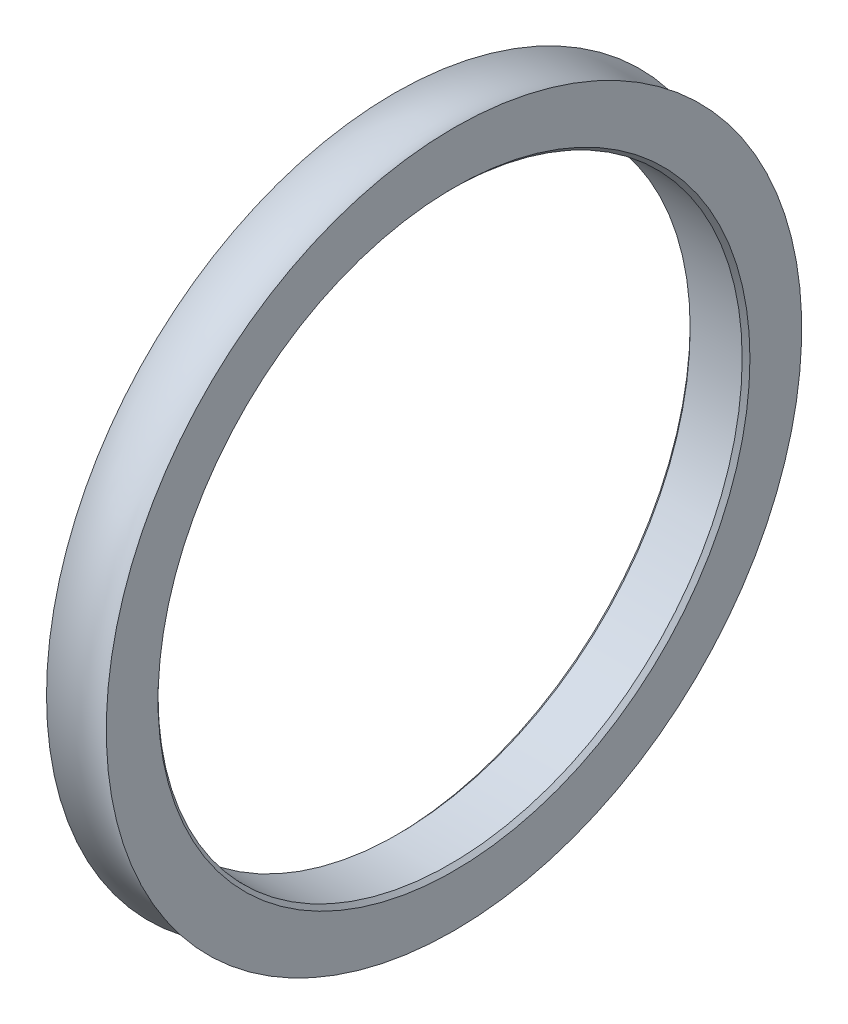
ISO-10303-21;
HEADER;
FILE_DESCRIPTION(('STEP AP214'),'2;1');
FILE_NAME('part.step','',(''),(''),'','','');
FILE_SCHEMA(('AUTOMOTIVE_DESIGN { 1 0 10303 214 1 1 1 1 }'));
ENDSEC;
DATA;
#1=APPLICATION_CONTEXT('core data for automotive mechanical design processes');
#2=APPLICATION_PROTOCOL_DEFINITION('international standard','automotive_design',2000,#1);
#3=PRODUCT_CONTEXT('',#1,'mechanical');
#4=PRODUCT('Part','Part','',(#3));
#5=PRODUCT_RELATED_PRODUCT_CATEGORY('part','',(#4));
#6=PRODUCT_DEFINITION_FORMATION('','',#4);
#7=PRODUCT_DEFINITION_CONTEXT('part definition',#1,'design');
#8=PRODUCT_DEFINITION('design','',#6,#7);
#9=PRODUCT_DEFINITION_SHAPE('','',#8);
#10=(LENGTH_UNIT() NAMED_UNIT(*) SI_UNIT(.MILLI.,.METRE.));
#11=(NAMED_UNIT(*) PLANE_ANGLE_UNIT() SI_UNIT($,.RADIAN.));
#12=(NAMED_UNIT(*) SI_UNIT($,.STERADIAN.) SOLID_ANGLE_UNIT());
#13=UNCERTAINTY_MEASURE_WITH_UNIT(LENGTH_MEASURE(1.E-05),#10,'distance_accuracy_value','');
#14=(GEOMETRIC_REPRESENTATION_CONTEXT(3) GLOBAL_UNCERTAINTY_ASSIGNED_CONTEXT((#13)) GLOBAL_UNIT_ASSIGNED_CONTEXT((#10,
#11,#12)) REPRESENTATION_CONTEXT('',''));
#15=CARTESIAN_POINT('',(0.,0.,0.));
#16=DIRECTION('',(0.,0.,1.));
#17=DIRECTION('',(1.,0.,0.));
#18=AXIS2_PLACEMENT_3D('',#15,#16,#17);
#19=CARTESIAN_POINT('',(5.46,0.,16.583911765355));
#20=DIRECTION('',(-1.,0.,0.));
#21=DIRECTION('',(0.,0.,1.));
#22=AXIS2_PLACEMENT_3D('',#19,#20,#21);
#23=PLANE('',#22);
#24=CARTESIAN_POINT('',(5.46,0.,0.));
#25=DIRECTION('',(1.,0.,0.));
#26=DIRECTION('',(0.,0.,1.));
#27=AXIS2_PLACEMENT_3D('',#24,#25,#26);
#28=CIRCLE('',#27,15.25025);
#29=CARTESIAN_POINT('',(5.46,0.,-15.25025));
#30=VERTEX_POINT('',#29);
#31=EDGE_CURVE('E47',#30,#30,#28,.T.);
#32=ORIENTED_EDGE('',*,*,#31,.T.);
#33=EDGE_LOOP('',(#32));
#34=FACE_BOUND('',#33,.T.);
#35=CARTESIAN_POINT('',(5.46,0.,0.));
#36=DIRECTION('',(1.,0.,0.));
#37=DIRECTION('',(0.,0.,1.));
#38=AXIS2_PLACEMENT_3D('',#35,#36,#37);
#39=CIRCLE('',#38,17.9175735307099);
#40=CARTESIAN_POINT('',(5.46,0.,17.9175735307099));
#41=VERTEX_POINT('',#40);
#42=EDGE_CURVE('E63',#41,#41,#39,.T.);
#43=ORIENTED_EDGE('',*,*,#42,.F.);
#44=EDGE_LOOP('',(#43));
#45=FACE_BOUND('',#44,.T.);
#46=ADVANCED_FACE('F17',(#34,#45),#23,.T.);
#47=CARTESIAN_POINT('',(8.54,0.,16.583911765355));
#48=DIRECTION('',(1.,0.,0.));
#49=DIRECTION('',(0.,1.,0.));
#50=AXIS2_PLACEMENT_3D('',#47,#48,#49);
#51=PLANE('',#50);
#52=CARTESIAN_POINT('',(8.54,0.,0.));
#53=DIRECTION('',(1.,0.,0.));
#54=DIRECTION('',(0.,0.,1.));
#55=AXIS2_PLACEMENT_3D('',#52,#53,#54);
#56=CIRCLE('',#55,15.25025);
#57=CARTESIAN_POINT('',(8.54,0.,-15.25025));
#58=VERTEX_POINT('',#57);
#59=EDGE_CURVE('E11',#58,#58,#56,.T.);
#60=ORIENTED_EDGE('',*,*,#59,.F.);
#61=EDGE_LOOP('',(#60));
#62=FACE_BOUND('',#61,.T.);
#63=CARTESIAN_POINT('',(8.54,0.,0.));
#64=DIRECTION('',(1.,0.,0.));
#65=DIRECTION('',(0.,0.,1.));
#66=AXIS2_PLACEMENT_3D('',#63,#64,#65);
#67=CIRCLE('',#66,17.9175735307099);
#68=CARTESIAN_POINT('',(8.54,17.9175735307099,0.));
#69=VERTEX_POINT('',#68);
#70=EDGE_CURVE('E66',#69,#69,#67,.T.);
#71=ORIENTED_EDGE('',*,*,#70,.T.);
#72=EDGE_LOOP('',(#71));
#73=FACE_BOUND('',#72,.T.);
#74=ADVANCED_FACE('F87',(#62,#73),#51,.T.);
#75=CARTESIAN_POINT('',(8.44,0.,0.));
#76=DIRECTION('',(1.,0.,0.));
#77=DIRECTION('',(0.,0.,1.));
#78=AXIS2_PLACEMENT_3D('',#75,#76,#77);
#79=CONICAL_SURFACE('',#78,15.15025,0.785398163397446);
#80=CARTESIAN_POINT('',(8.34,0.,0.));
#81=DIRECTION('',(1.,0.,0.));
#82=DIRECTION('',(0.,0.,1.));
#83=AXIS2_PLACEMENT_3D('',#80,#81,#82);
#84=CIRCLE('',#83,15.05025);
#85=CARTESIAN_POINT('',(8.34,0.,-15.05025));
#86=VERTEX_POINT('',#85);
#87=EDGE_CURVE('E27',#86,#86,#84,.T.);
#88=ORIENTED_EDGE('',*,*,#87,.F.);
#89=EDGE_LOOP('',(#88));
#90=FACE_BOUND('',#89,.T.);
#91=ORIENTED_EDGE('',*,*,#59,.T.);
#92=EDGE_LOOP('',(#91));
#93=FACE_BOUND('',#92,.T.);
#94=ADVANCED_FACE('F97',(#90,#93),#79,.F.);
#95=CARTESIAN_POINT('',(7.,0.,0.));
#96=DIRECTION('',(1.,0.,0.));
#97=DIRECTION('',(0.,0.,1.));
#98=AXIS2_PLACEMENT_3D('',#95,#96,#97);
#99=CYLINDRICAL_SURFACE('',#98,15.05025);
#100=CARTESIAN_POINT('',(5.66,0.,0.));
#101=DIRECTION('',(1.,0.,0.));
#102=DIRECTION('',(0.,0.,1.));
#103=AXIS2_PLACEMENT_3D('',#100,#101,#102);
#104=CIRCLE('',#103,15.05025);
#105=CARTESIAN_POINT('',(5.66,0.,-15.05025));
#106=VERTEX_POINT('',#105);
#107=EDGE_CURVE('E54',#106,#106,#104,.T.);
#108=ORIENTED_EDGE('',*,*,#107,.F.);
#109=EDGE_LOOP('',(#108));
#110=FACE_BOUND('',#109,.T.);
#111=ORIENTED_EDGE('',*,*,#87,.T.);
#112=EDGE_LOOP('',(#111));
#113=FACE_BOUND('',#112,.T.);
#114=ADVANCED_FACE('F109',(#110,#113),#99,.F.);
#115=CARTESIAN_POINT('',(5.56,0.,0.));
#116=DIRECTION('',(-1.,0.,0.));
#117=DIRECTION('',(0.,0.,1.));
#118=AXIS2_PLACEMENT_3D('',#115,#116,#117);
#119=CONICAL_SURFACE('',#118,15.15025,0.785398163397443);
#120=ORIENTED_EDGE('',*,*,#31,.F.);
#121=EDGE_LOOP('',(#120));
#122=FACE_BOUND('',#121,.T.);
#123=ORIENTED_EDGE('',*,*,#107,.T.);
#124=EDGE_LOOP('',(#123));
#125=FACE_BOUND('',#124,.T.);
#126=ADVANCED_FACE('F104',(#122,#125),#119,.F.);
#127=CARTESIAN_POINT('',(7.,0.,0.));
#128=DIRECTION('',(1.,0.,0.));
#129=DIRECTION('',(0.,1.,0.));
#130=AXIS2_PLACEMENT_3D('',#127,#128,#129);
#131=TOROIDAL_SURFACE('',#130,20.,2.59);
#132=ORIENTED_EDGE('',*,*,#70,.F.);
#133=EDGE_LOOP('',(#132));
#134=FACE_BOUND('',#133,.T.);
#135=ORIENTED_EDGE('',*,*,#42,.T.);
#136=EDGE_LOOP('',(#135));
#137=FACE_BOUND('',#136,.T.);
#138=ADVANCED_FACE('F19',(#134,#137),#131,.F.);
#139=CLOSED_SHELL('',(#46,#74,#94,#114,#126,#138));
#140=MANIFOLD_SOLID_BREP('B1',#139);
#141=ADVANCED_BREP_SHAPE_REPRESENTATION('',(#18,#140),#14);
#142=SHAPE_DEFINITION_REPRESENTATION(#9,#141);
ENDSEC;
END-ISO-10303-21;
